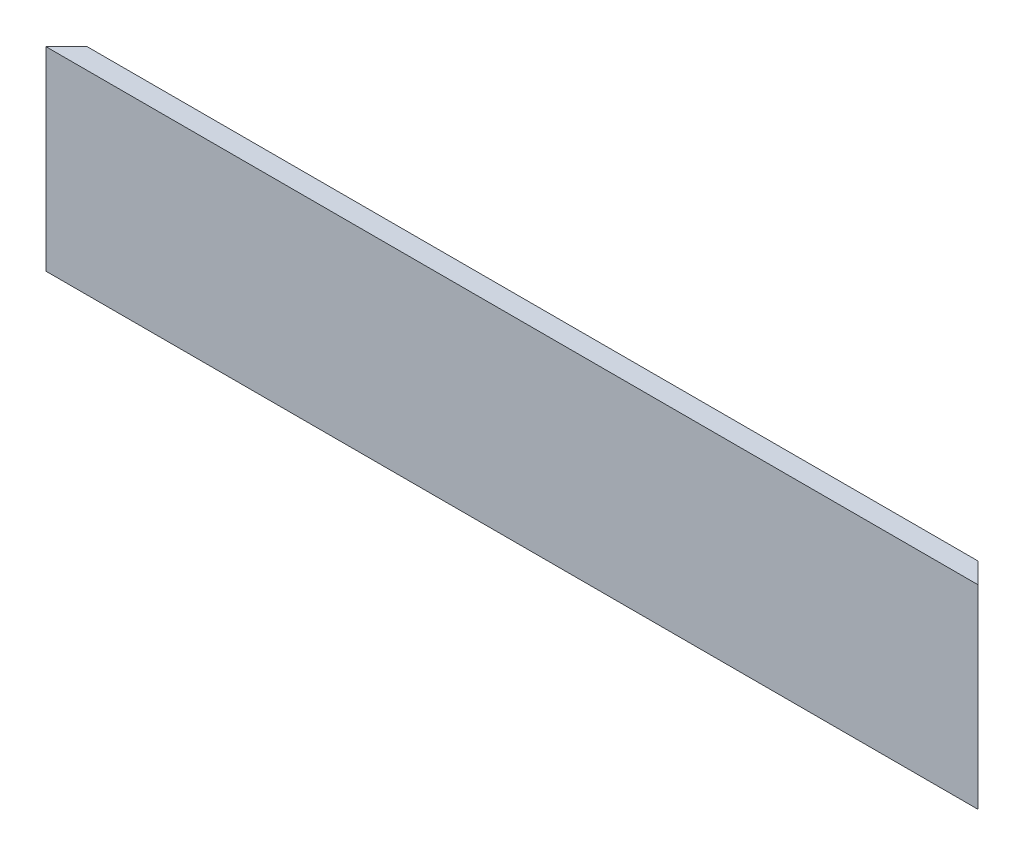
ISO-10303-21;
HEADER;
FILE_DESCRIPTION(('STEP AP214'),'2;1');
FILE_NAME('part.step','',(''),(''),'','','');
FILE_SCHEMA(('AUTOMOTIVE_DESIGN { 1 0 10303 214 1 1 1 1 }'));
ENDSEC;
DATA;
#1=APPLICATION_CONTEXT('core data for automotive mechanical design processes');
#2=APPLICATION_PROTOCOL_DEFINITION('international standard','automotive_design',2000,#1);
#3=PRODUCT_CONTEXT('',#1,'mechanical');
#4=PRODUCT('Part','Part','',(#3));
#5=PRODUCT_RELATED_PRODUCT_CATEGORY('part','',(#4));
#6=PRODUCT_DEFINITION_FORMATION('','',#4);
#7=PRODUCT_DEFINITION_CONTEXT('part definition',#1,'design');
#8=PRODUCT_DEFINITION('design','',#6,#7);
#9=PRODUCT_DEFINITION_SHAPE('','',#8);
#10=(LENGTH_UNIT() NAMED_UNIT(*) SI_UNIT(.MILLI.,.METRE.));
#11=(NAMED_UNIT(*) PLANE_ANGLE_UNIT() SI_UNIT($,.RADIAN.));
#12=(NAMED_UNIT(*) SI_UNIT($,.STERADIAN.) SOLID_ANGLE_UNIT());
#13=UNCERTAINTY_MEASURE_WITH_UNIT(LENGTH_MEASURE(1.E-05),#10,'distance_accuracy_value','');
#14=(GEOMETRIC_REPRESENTATION_CONTEXT(3) GLOBAL_UNCERTAINTY_ASSIGNED_CONTEXT((#13)) GLOBAL_UNIT_ASSIGNED_CONTEXT((#10,
#11,#12)) REPRESENTATION_CONTEXT('',''));
#15=CARTESIAN_POINT('',(0.,0.,0.));
#16=DIRECTION('',(0.,0.,1.));
#17=DIRECTION('',(1.,0.,0.));
#18=AXIS2_PLACEMENT_3D('',#15,#16,#17);
#19=CARTESIAN_POINT('',(287.5,60.0000000000001,12.7));
#20=DIRECTION('',(0.,-1.,0.));
#21=DIRECTION('',(1.,0.,0.));
#22=AXIS2_PLACEMENT_3D('',#19,#20,#21);
#23=PLANE('',#22);
#24=DIRECTION('',(-1.,0.,0.));
#25=VECTOR('',#24,1.);
#26=CARTESIAN_POINT('',(287.5,60.0000000000001,12.7));
#27=LINE('',#26,#25);
#28=CARTESIAN_POINT('',(287.5,60.0000000000001,12.7));
#29=VERTEX_POINT('',#28);
#30=CARTESIAN_POINT('',(-287.5,60.,12.7));
#31=VERTEX_POINT('',#30);
#32=EDGE_CURVE('E83',#29,#31,#27,.T.);
#33=ORIENTED_EDGE('',*,*,#32,.F.);
#34=DIRECTION('',(0.707106781186549,0.,0.707106781186546));
#35=VECTOR('',#34,1.);
#36=CARTESIAN_POINT('',(287.5,60.0000000000001,12.6999999999999));
#37=LINE('',#36,#35);
#38=CARTESIAN_POINT('',(274.8,60.0000000000001,0.));
#39=VERTEX_POINT('',#38);
#40=EDGE_CURVE('E104',#29,#39,#37,.F.);
#41=ORIENTED_EDGE('',*,*,#40,.T.);
#42=DIRECTION('',(-1.,0.,0.));
#43=VECTOR('',#42,1.);
#44=CARTESIAN_POINT('',(287.5,60.0000000000001,0.));
#45=LINE('',#44,#43);
#46=CARTESIAN_POINT('',(-274.8,60.,0.));
#47=VERTEX_POINT('',#46);
#48=EDGE_CURVE('E86',#39,#47,#45,.T.);
#49=ORIENTED_EDGE('',*,*,#48,.T.);
#50=DIRECTION('',(0.707106781186549,0.,-0.707106781186546));
#51=VECTOR('',#50,1.);
#52=CARTESIAN_POINT('',(-287.5,60.,12.6999999999999));
#53=LINE('',#52,#51);
#54=EDGE_CURVE('E100',#47,#31,#53,.F.);
#55=ORIENTED_EDGE('',*,*,#54,.T.);
#56=EDGE_LOOP('',(#33,#41,#49,#55));
#57=FACE_BOUND('',#56,.T.);
#58=ADVANCED_FACE('F36',(#57),#23,.F.);
#59=CARTESIAN_POINT('',(0.,0.,12.7));
#60=DIRECTION('',(0.,0.,1.));
#61=DIRECTION('',(1.,0.,0.));
#62=AXIS2_PLACEMENT_3D('',#59,#60,#61);
#63=PLANE('',#62);
#64=DIRECTION('',(0.,-1.,0.));
#65=VECTOR('',#64,1.);
#66=CARTESIAN_POINT('',(-287.5,-60.,12.7));
#67=LINE('',#66,#65);
#68=CARTESIAN_POINT('',(-287.5,-60.,12.7));
#69=VERTEX_POINT('',#68);
#70=EDGE_CURVE('E75',#31,#69,#67,.T.);
#71=ORIENTED_EDGE('',*,*,#70,.T.);
#72=DIRECTION('',(1.,0.,0.));
#73=VECTOR('',#72,1.);
#74=CARTESIAN_POINT('',(287.5,-59.9999999999999,12.7));
#75=LINE('',#74,#73);
#76=CARTESIAN_POINT('',(287.5,-59.9999999999999,12.7));
#77=VERTEX_POINT('',#76);
#78=EDGE_CURVE('E80',#69,#77,#75,.T.);
#79=ORIENTED_EDGE('',*,*,#78,.T.);
#80=DIRECTION('',(0.,1.,0.));
#81=VECTOR('',#80,1.);
#82=CARTESIAN_POINT('',(287.5,-59.9999999999999,12.7));
#83=LINE('',#82,#81);
#84=EDGE_CURVE('E95',#77,#29,#83,.T.);
#85=ORIENTED_EDGE('',*,*,#84,.T.);
#86=ORIENTED_EDGE('',*,*,#32,.T.);
#87=EDGE_LOOP('',(#71,#79,#85,#86));
#88=FACE_BOUND('',#87,.T.);
#89=ADVANCED_FACE('F77',(#88),#63,.T.);
#90=CARTESIAN_POINT('',(0.,0.,0.));
#91=DIRECTION('',(0.,0.,1.));
#92=DIRECTION('',(1.,0.,0.));
#93=AXIS2_PLACEMENT_3D('',#90,#91,#92);
#94=PLANE('',#93);
#95=ORIENTED_EDGE('',*,*,#48,.F.);
#96=DIRECTION('',(0.,-1.,0.));
#97=VECTOR('',#96,1.);
#98=CARTESIAN_POINT('',(274.8,0.,0.));
#99=LINE('',#98,#97);
#100=CARTESIAN_POINT('',(274.8,-47.3,0.));
#101=VERTEX_POINT('',#100);
#102=EDGE_CURVE('E11',#39,#101,#99,.T.);
#103=ORIENTED_EDGE('',*,*,#102,.T.);
#104=DIRECTION('',(-1.,0.,0.));
#105=VECTOR('',#104,1.);
#106=CARTESIAN_POINT('',(0.,-47.3,0.));
#107=LINE('',#106,#105);
#108=CARTESIAN_POINT('',(-274.8,-47.3,0.));
#109=VERTEX_POINT('',#108);
#110=EDGE_CURVE('E45',#101,#109,#107,.T.);
#111=ORIENTED_EDGE('',*,*,#110,.T.);
#112=DIRECTION('',(0.,1.,0.));
#113=VECTOR('',#112,1.);
#114=CARTESIAN_POINT('',(-274.8,0.,0.));
#115=LINE('',#114,#113);
#116=EDGE_CURVE('E89',#109,#47,#115,.T.);
#117=ORIENTED_EDGE('',*,*,#116,.T.);
#118=EDGE_LOOP('',(#95,#103,#111,#117));
#119=FACE_BOUND('',#118,.T.);
#120=ADVANCED_FACE('F110',(#119),#94,.F.);
#121=CARTESIAN_POINT('',(-287.5,-60.,12.6999999999999));
#122=DIRECTION('',(0.707106781186546,0.,0.707106781186549));
#123=DIRECTION('',(0.,-1.,0.));
#124=AXIS2_PLACEMENT_3D('',#121,#122,#123);
#125=PLANE('',#124);
#126=ORIENTED_EDGE('',*,*,#54,.F.);
#127=ORIENTED_EDGE('',*,*,#116,.F.);
#128=DIRECTION('',(-0.577350269189627,-0.577350269189627,0.577350269189624));
#129=VECTOR('',#128,1.);
#130=CARTESIAN_POINT('',(-287.5,-60.,12.6999999999999));
#131=LINE('',#130,#129);
#132=EDGE_CURVE('E40',#69,#109,#131,.F.);
#133=ORIENTED_EDGE('',*,*,#132,.F.);
#134=ORIENTED_EDGE('',*,*,#70,.F.);
#135=EDGE_LOOP('',(#126,#127,#133,#134));
#136=FACE_BOUND('',#135,.T.);
#137=ADVANCED_FACE('F38',(#136),#125,.F.);
#138=CARTESIAN_POINT('',(287.5,-59.9999999999999,12.6999999999999));
#139=DIRECTION('',(0.,0.707106781186546,0.707106781186549));
#140=DIRECTION('',(1.,0.,0.));
#141=AXIS2_PLACEMENT_3D('',#138,#139,#140);
#142=PLANE('',#141);
#143=ORIENTED_EDGE('',*,*,#132,.T.);
#144=ORIENTED_EDGE('',*,*,#110,.F.);
#145=DIRECTION('',(0.577350269189627,-0.577350269189627,0.577350269189624));
#146=VECTOR('',#145,1.);
#147=CARTESIAN_POINT('',(287.5,-59.9999999999999,12.6999999999999));
#148=LINE('',#147,#146);
#149=EDGE_CURVE('E91',#77,#101,#148,.F.);
#150=ORIENTED_EDGE('',*,*,#149,.F.);
#151=ORIENTED_EDGE('',*,*,#78,.F.);
#152=EDGE_LOOP('',(#143,#144,#150,#151));
#153=FACE_BOUND('',#152,.T.);
#154=ADVANCED_FACE('F92',(#153),#142,.F.);
#155=CARTESIAN_POINT('',(287.5,-59.9999999999999,12.6999999999999));
#156=DIRECTION('',(-0.707106781186546,0.,0.707106781186549));
#157=DIRECTION('',(0.,1.,0.));
#158=AXIS2_PLACEMENT_3D('',#155,#156,#157);
#159=PLANE('',#158);
#160=ORIENTED_EDGE('',*,*,#149,.T.);
#161=ORIENTED_EDGE('',*,*,#102,.F.);
#162=ORIENTED_EDGE('',*,*,#40,.F.);
#163=ORIENTED_EDGE('',*,*,#84,.F.);
#164=EDGE_LOOP('',(#160,#161,#162,#163));
#165=FACE_BOUND('',#164,.T.);
#166=ADVANCED_FACE('F108',(#165),#159,.F.);
#167=CLOSED_SHELL('',(#58,#89,#120,#137,#154,#166));
#168=MANIFOLD_SOLID_BREP('B2',#167);
#169=ADVANCED_BREP_SHAPE_REPRESENTATION('',(#18,#168),#14);
#170=SHAPE_DEFINITION_REPRESENTATION(#9,#169);
ENDSEC;
END-ISO-10303-21;
